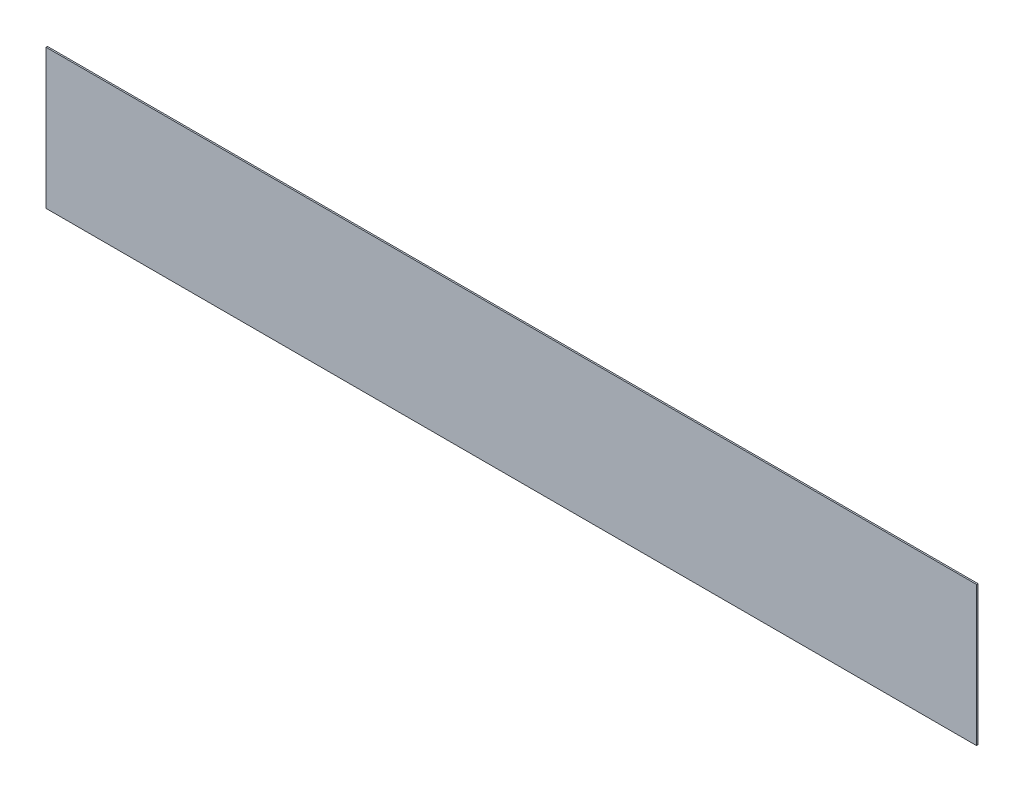
ISO-10303-21;
HEADER;
FILE_DESCRIPTION(('STEP AP214'),'2;1');
FILE_NAME('part.step','',(''),(''),'','','');
FILE_SCHEMA(('AUTOMOTIVE_DESIGN { 1 0 10303 214 1 1 1 1 }'));
ENDSEC;
DATA;
#1=APPLICATION_CONTEXT('core data for automotive mechanical design processes');
#2=APPLICATION_PROTOCOL_DEFINITION('international standard','automotive_design',2000,#1);
#3=PRODUCT_CONTEXT('',#1,'mechanical');
#4=PRODUCT('Part','Part','',(#3));
#5=PRODUCT_RELATED_PRODUCT_CATEGORY('part','',(#4));
#6=PRODUCT_DEFINITION_FORMATION('','',#4);
#7=PRODUCT_DEFINITION_CONTEXT('part definition',#1,'design');
#8=PRODUCT_DEFINITION('design','',#6,#7);
#9=PRODUCT_DEFINITION_SHAPE('','',#8);
#10=(LENGTH_UNIT() NAMED_UNIT(*) SI_UNIT(.MILLI.,.METRE.));
#11=(NAMED_UNIT(*) PLANE_ANGLE_UNIT() SI_UNIT($,.RADIAN.));
#12=(NAMED_UNIT(*) SI_UNIT($,.STERADIAN.) SOLID_ANGLE_UNIT());
#13=UNCERTAINTY_MEASURE_WITH_UNIT(LENGTH_MEASURE(1.E-05),#10,'distance_accuracy_value','');
#14=(GEOMETRIC_REPRESENTATION_CONTEXT(3) GLOBAL_UNCERTAINTY_ASSIGNED_CONTEXT((#13)) GLOBAL_UNIT_ASSIGNED_CONTEXT((#10,
#11,#12)) REPRESENTATION_CONTEXT('',''));
#15=CARTESIAN_POINT('',(0.,0.,0.));
#16=DIRECTION('',(0.,0.,1.));
#17=DIRECTION('',(1.,0.,0.));
#18=AXIS2_PLACEMENT_3D('',#15,#16,#17);
#19=CARTESIAN_POINT('',(-508.,-76.2000000000001,1.5875));
#20=DIRECTION('',(1.,0.,0.));
#21=DIRECTION('',(0.,0.,-1.));
#22=AXIS2_PLACEMENT_3D('',#19,#20,#21);
#23=PLANE('',#22);
#24=DIRECTION('',(0.,-1.,0.));
#25=VECTOR('',#24,1.);
#26=CARTESIAN_POINT('',(-508.,-76.2000000000001,0.));
#27=LINE('',#26,#25);
#28=CARTESIAN_POINT('',(-508.,76.1999999999999,0.));
#29=VERTEX_POINT('',#28);
#30=CARTESIAN_POINT('',(-508.,-76.2000000000001,0.));
#31=VERTEX_POINT('',#30);
#32=EDGE_CURVE('E107',#29,#31,#27,.T.);
#33=ORIENTED_EDGE('',*,*,#32,.T.);
#34=DIRECTION('',(0.,0.,-1.));
#35=VECTOR('',#34,1.);
#36=CARTESIAN_POINT('',(-508.,-76.2000000000001,1.5875));
#37=LINE('',#36,#35);
#38=CARTESIAN_POINT('',(-508.,-76.2000000000001,1.5875));
#39=VERTEX_POINT('',#38);
#40=EDGE_CURVE('E11',#39,#31,#37,.T.);
#41=ORIENTED_EDGE('',*,*,#40,.F.);
#42=DIRECTION('',(0.,-1.,0.));
#43=VECTOR('',#42,1.);
#44=CARTESIAN_POINT('',(-508.,-76.2000000000001,1.5875));
#45=LINE('',#44,#43);
#46=CARTESIAN_POINT('',(-508.,76.1999999999999,1.5875));
#47=VERTEX_POINT('',#46);
#48=EDGE_CURVE('E91',#47,#39,#45,.T.);
#49=ORIENTED_EDGE('',*,*,#48,.F.);
#50=DIRECTION('',(0.,0.,-1.));
#51=VECTOR('',#50,1.);
#52=CARTESIAN_POINT('',(-508.,76.1999999999999,1.5875));
#53=LINE('',#52,#51);
#54=EDGE_CURVE('E103',#47,#29,#53,.T.);
#55=ORIENTED_EDGE('',*,*,#54,.T.);
#56=EDGE_LOOP('',(#33,#41,#49,#55));
#57=FACE_BOUND('',#56,.T.);
#58=ADVANCED_FACE('F39',(#57),#23,.F.);
#59=CARTESIAN_POINT('',(508.,-76.1999999999999,1.5875));
#60=DIRECTION('',(0.,1.,0.));
#61=DIRECTION('',(-1.,0.,0.));
#62=AXIS2_PLACEMENT_3D('',#59,#60,#61);
#63=PLANE('',#62);
#64=DIRECTION('',(1.,0.,0.));
#65=VECTOR('',#64,1.);
#66=CARTESIAN_POINT('',(508.,-76.1999999999999,0.));
#67=LINE('',#66,#65);
#68=CARTESIAN_POINT('',(508.,-76.1999999999999,0.));
#69=VERTEX_POINT('',#68);
#70=EDGE_CURVE('E96',#31,#69,#67,.T.);
#71=ORIENTED_EDGE('',*,*,#70,.T.);
#72=DIRECTION('',(0.,0.,-1.));
#73=VECTOR('',#72,1.);
#74=CARTESIAN_POINT('',(508.,-76.1999999999999,1.5875));
#75=LINE('',#74,#73);
#76=CARTESIAN_POINT('',(508.,-76.1999999999999,1.5875));
#77=VERTEX_POINT('',#76);
#78=EDGE_CURVE('E48',#77,#69,#75,.T.);
#79=ORIENTED_EDGE('',*,*,#78,.F.);
#80=DIRECTION('',(1.,0.,0.));
#81=VECTOR('',#80,1.);
#82=CARTESIAN_POINT('',(508.,-76.1999999999999,1.5875));
#83=LINE('',#82,#81);
#84=EDGE_CURVE('E86',#39,#77,#83,.T.);
#85=ORIENTED_EDGE('',*,*,#84,.F.);
#86=ORIENTED_EDGE('',*,*,#40,.T.);
#87=EDGE_LOOP('',(#71,#79,#85,#86));
#88=FACE_BOUND('',#87,.T.);
#89=ADVANCED_FACE('F95',(#88),#63,.F.);
#90=CARTESIAN_POINT('',(508.,-76.1999999999999,1.5875));
#91=DIRECTION('',(-1.,0.,0.));
#92=DIRECTION('',(0.,0.,1.));
#93=AXIS2_PLACEMENT_3D('',#90,#91,#92);
#94=PLANE('',#93);
#95=DIRECTION('',(0.,1.,0.));
#96=VECTOR('',#95,1.);
#97=CARTESIAN_POINT('',(508.,-76.1999999999999,0.));
#98=LINE('',#97,#96);
#99=CARTESIAN_POINT('',(508.,76.2000000000001,0.));
#100=VERTEX_POINT('',#99);
#101=EDGE_CURVE('E73',#69,#100,#98,.T.);
#102=ORIENTED_EDGE('',*,*,#101,.T.);
#103=DIRECTION('',(0.,0.,-1.));
#104=VECTOR('',#103,1.);
#105=CARTESIAN_POINT('',(508.,76.2000000000001,1.5875));
#106=LINE('',#105,#104);
#107=CARTESIAN_POINT('',(508.,76.2000000000001,1.5875));
#108=VERTEX_POINT('',#107);
#109=EDGE_CURVE('E98',#108,#100,#106,.T.);
#110=ORIENTED_EDGE('',*,*,#109,.F.);
#111=DIRECTION('',(0.,1.,0.));
#112=VECTOR('',#111,1.);
#113=CARTESIAN_POINT('',(508.,-76.1999999999999,1.5875));
#114=LINE('',#113,#112);
#115=EDGE_CURVE('E89',#77,#108,#114,.T.);
#116=ORIENTED_EDGE('',*,*,#115,.F.);
#117=ORIENTED_EDGE('',*,*,#78,.T.);
#118=EDGE_LOOP('',(#102,#110,#116,#117));
#119=FACE_BOUND('',#118,.T.);
#120=ADVANCED_FACE('F99',(#119),#94,.F.);
#121=CARTESIAN_POINT('',(508.,76.2000000000001,1.5875));
#122=DIRECTION('',(0.,-1.,0.));
#123=DIRECTION('',(1.,0.,0.));
#124=AXIS2_PLACEMENT_3D('',#121,#122,#123);
#125=PLANE('',#124);
#126=DIRECTION('',(-1.,0.,0.));
#127=VECTOR('',#126,1.);
#128=CARTESIAN_POINT('',(508.,76.2000000000001,0.));
#129=LINE('',#128,#127);
#130=EDGE_CURVE('E79',#100,#29,#129,.T.);
#131=ORIENTED_EDGE('',*,*,#130,.T.);
#132=ORIENTED_EDGE('',*,*,#54,.F.);
#133=DIRECTION('',(-1.,0.,0.));
#134=VECTOR('',#133,1.);
#135=CARTESIAN_POINT('',(508.,76.2000000000001,1.5875));
#136=LINE('',#135,#134);
#137=EDGE_CURVE('E56',#108,#47,#136,.T.);
#138=ORIENTED_EDGE('',*,*,#137,.F.);
#139=ORIENTED_EDGE('',*,*,#109,.T.);
#140=EDGE_LOOP('',(#131,#132,#138,#139));
#141=FACE_BOUND('',#140,.T.);
#142=ADVANCED_FACE('F120',(#141),#125,.F.);
#143=CARTESIAN_POINT('',(0.,0.,1.5875));
#144=DIRECTION('',(0.,0.,1.));
#145=DIRECTION('',(1.,0.,0.));
#146=AXIS2_PLACEMENT_3D('',#143,#144,#145);
#147=PLANE('',#146);
#148=ORIENTED_EDGE('',*,*,#48,.T.);
#149=ORIENTED_EDGE('',*,*,#84,.T.);
#150=ORIENTED_EDGE('',*,*,#115,.T.);
#151=ORIENTED_EDGE('',*,*,#137,.T.);
#152=EDGE_LOOP('',(#148,#149,#150,#151));
#153=FACE_BOUND('',#152,.T.);
#154=ADVANCED_FACE('F87',(#153),#147,.T.);
#155=CARTESIAN_POINT('',(0.,0.,0.));
#156=DIRECTION('',(0.,0.,1.));
#157=DIRECTION('',(1.,0.,0.));
#158=AXIS2_PLACEMENT_3D('',#155,#156,#157);
#159=PLANE('',#158);
#160=ORIENTED_EDGE('',*,*,#32,.F.);
#161=ORIENTED_EDGE('',*,*,#130,.F.);
#162=ORIENTED_EDGE('',*,*,#101,.F.);
#163=ORIENTED_EDGE('',*,*,#70,.F.);
#164=EDGE_LOOP('',(#160,#161,#162,#163));
#165=FACE_BOUND('',#164,.T.);
#166=ADVANCED_FACE('F123',(#165),#159,.F.);
#167=CLOSED_SHELL('',(#58,#89,#120,#142,#154,#166));
#168=MANIFOLD_SOLID_BREP('B2',#167);
#169=ADVANCED_BREP_SHAPE_REPRESENTATION('',(#18,#168),#14);
#170=SHAPE_DEFINITION_REPRESENTATION(#9,#169);
ENDSEC;
END-ISO-10303-21;
